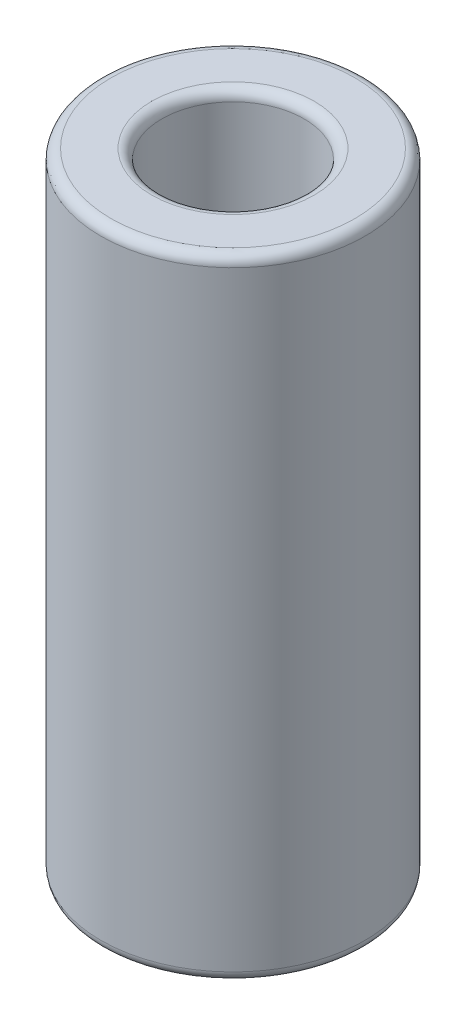
ISO-10303-21;
HEADER;
FILE_DESCRIPTION(('STEP AP214'),'2;1');
FILE_NAME('part.step','',(''),(''),'','','');
FILE_SCHEMA(('AUTOMOTIVE_DESIGN { 1 0 10303 214 1 1 1 1 }'));
ENDSEC;
DATA;
#1=APPLICATION_CONTEXT('core data for automotive mechanical design processes');
#2=APPLICATION_PROTOCOL_DEFINITION('international standard','automotive_design',2000,#1);
#3=PRODUCT_CONTEXT('',#1,'mechanical');
#4=PRODUCT('Part','Part','',(#3));
#5=PRODUCT_RELATED_PRODUCT_CATEGORY('part','',(#4));
#6=PRODUCT_DEFINITION_FORMATION('','',#4);
#7=PRODUCT_DEFINITION_CONTEXT('part definition',#1,'design');
#8=PRODUCT_DEFINITION('design','',#6,#7);
#9=PRODUCT_DEFINITION_SHAPE('','',#8);
#10=(LENGTH_UNIT() NAMED_UNIT(*) SI_UNIT(.MILLI.,.METRE.));
#11=(NAMED_UNIT(*) PLANE_ANGLE_UNIT() SI_UNIT($,.RADIAN.));
#12=(NAMED_UNIT(*) SI_UNIT($,.STERADIAN.) SOLID_ANGLE_UNIT());
#13=UNCERTAINTY_MEASURE_WITH_UNIT(LENGTH_MEASURE(1.E-05),#10,'distance_accuracy_value','');
#14=(GEOMETRIC_REPRESENTATION_CONTEXT(3) GLOBAL_UNCERTAINTY_ASSIGNED_CONTEXT((#13)) GLOBAL_UNIT_ASSIGNED_CONTEXT((#10,
#11,#12)) REPRESENTATION_CONTEXT('',''));
#15=CARTESIAN_POINT('',(0.,0.,0.));
#16=DIRECTION('',(0.,0.,1.));
#17=DIRECTION('',(1.,0.,0.));
#18=AXIS2_PLACEMENT_3D('',#15,#16,#17);
#19=CARTESIAN_POINT('',(0.,62.,0.));
#20=DIRECTION('',(0.,1.,0.));
#21=DIRECTION('',(0.,0.,1.));
#22=AXIS2_PLACEMENT_3D('',#19,#20,#21);
#23=PLANE('',#22);
#24=CARTESIAN_POINT('',(0.,62.,0.));
#25=DIRECTION('',(0.,1.,0.));
#26=DIRECTION('',(0.,0.,1.));
#27=AXIS2_PLACEMENT_3D('',#24,#25,#26);
#28=CIRCLE('',#27,8.);
#29=CARTESIAN_POINT('',(0.,62.,8.));
#30=VERTEX_POINT('',#29);
#31=EDGE_CURVE('E10',#30,#30,#28,.F.);
#32=ORIENTED_EDGE('',*,*,#31,.T.);
#33=EDGE_LOOP('',(#32));
#34=FACE_BOUND('',#33,.T.);
#35=CARTESIAN_POINT('',(0.,62.,0.));
#36=DIRECTION('',(0.,1.,0.));
#37=DIRECTION('',(0.,0.,1.));
#38=AXIS2_PLACEMENT_3D('',#35,#36,#37);
#39=CIRCLE('',#38,12.);
#40=CARTESIAN_POINT('',(0.,62.,12.));
#41=VERTEX_POINT('',#40);
#42=EDGE_CURVE('E67',#41,#41,#39,.T.);
#43=ORIENTED_EDGE('',*,*,#42,.T.);
#44=EDGE_LOOP('',(#43));
#45=FACE_BOUND('',#44,.T.);
#46=ADVANCED_FACE('F43',(#34,#45),#23,.T.);
#47=CARTESIAN_POINT('',(0.,0.,0.));
#48=DIRECTION('',(0.,1.,0.));
#49=DIRECTION('',(0.,0.,1.));
#50=AXIS2_PLACEMENT_3D('',#47,#48,#49);
#51=PLANE('',#50);
#52=CARTESIAN_POINT('',(0.,0.,0.));
#53=DIRECTION('',(0.,1.,0.));
#54=DIRECTION('',(0.,0.,1.));
#55=AXIS2_PLACEMENT_3D('',#52,#53,#54);
#56=CIRCLE('',#55,8.);
#57=CARTESIAN_POINT('',(0.,0.,8.));
#58=VERTEX_POINT('',#57);
#59=EDGE_CURVE('E61',#58,#58,#56,.T.);
#60=ORIENTED_EDGE('',*,*,#59,.T.);
#61=EDGE_LOOP('',(#60));
#62=FACE_BOUND('',#61,.T.);
#63=CARTESIAN_POINT('',(0.,0.,0.));
#64=DIRECTION('',(0.,1.,0.));
#65=DIRECTION('',(0.,0.,1.));
#66=AXIS2_PLACEMENT_3D('',#63,#64,#65);
#67=CIRCLE('',#66,12.);
#68=CARTESIAN_POINT('',(0.,0.,12.));
#69=VERTEX_POINT('',#68);
#70=EDGE_CURVE('E71',#69,#69,#67,.F.);
#71=ORIENTED_EDGE('',*,*,#70,.T.);
#72=EDGE_LOOP('',(#71));
#73=FACE_BOUND('',#72,.T.);
#74=ADVANCED_FACE('F95',(#62,#73),#51,.F.);
#75=CARTESIAN_POINT('',(0.,62.,0.));
#76=DIRECTION('',(0.,-1.,0.));
#77=DIRECTION('',(0.,0.,-1.));
#78=AXIS2_PLACEMENT_3D('',#75,#76,#77);
#79=CYLINDRICAL_SURFACE('',#78,13.);
#80=CARTESIAN_POINT('',(0.,1.,0.));
#81=DIRECTION('',(0.,1.,0.));
#82=DIRECTION('',(0.,0.,1.));
#83=AXIS2_PLACEMENT_3D('',#80,#81,#82);
#84=CIRCLE('',#83,13.);
#85=CARTESIAN_POINT('',(0.,1.,13.));
#86=VERTEX_POINT('',#85);
#87=EDGE_CURVE('E75',#86,#86,#84,.T.);
#88=ORIENTED_EDGE('',*,*,#87,.T.);
#89=EDGE_LOOP('',(#88));
#90=FACE_BOUND('',#89,.T.);
#91=CARTESIAN_POINT('',(0.,61.,0.));
#92=DIRECTION('',(0.,1.,0.));
#93=DIRECTION('',(0.,0.,1.));
#94=AXIS2_PLACEMENT_3D('',#91,#92,#93);
#95=CIRCLE('',#94,13.);
#96=CARTESIAN_POINT('',(0.,61.,13.));
#97=VERTEX_POINT('',#96);
#98=EDGE_CURVE('E79',#97,#97,#95,.F.);
#99=ORIENTED_EDGE('',*,*,#98,.T.);
#100=EDGE_LOOP('',(#99));
#101=FACE_BOUND('',#100,.T.);
#102=ADVANCED_FACE('F84',(#90,#101),#79,.T.);
#103=CARTESIAN_POINT('',(0.,62.,0.));
#104=DIRECTION('',(0.,-1.,0.));
#105=DIRECTION('',(0.,0.,-1.));
#106=AXIS2_PLACEMENT_3D('',#103,#104,#105);
#107=CYLINDRICAL_SURFACE('',#106,7.);
#108=CARTESIAN_POINT('',(0.,1.,0.));
#109=DIRECTION('',(0.,1.,0.));
#110=DIRECTION('',(0.,0.,1.));
#111=AXIS2_PLACEMENT_3D('',#108,#109,#110);
#112=CIRCLE('',#111,7.);
#113=CARTESIAN_POINT('',(0.,1.,7.));
#114=VERTEX_POINT('',#113);
#115=EDGE_CURVE('E51',#114,#114,#112,.F.);
#116=ORIENTED_EDGE('',*,*,#115,.T.);
#117=EDGE_LOOP('',(#116));
#118=FACE_BOUND('',#117,.T.);
#119=CARTESIAN_POINT('',(0.,61.,0.));
#120=DIRECTION('',(0.,1.,0.));
#121=DIRECTION('',(0.,0.,1.));
#122=AXIS2_PLACEMENT_3D('',#119,#120,#121);
#123=CIRCLE('',#122,7.);
#124=CARTESIAN_POINT('',(0.,61.,7.));
#125=VERTEX_POINT('',#124);
#126=EDGE_CURVE('E56',#125,#125,#123,.T.);
#127=ORIENTED_EDGE('',*,*,#126,.T.);
#128=EDGE_LOOP('',(#127));
#129=FACE_BOUND('',#128,.T.);
#130=ADVANCED_FACE('F103',(#118,#129),#107,.F.);
#131=CARTESIAN_POINT('',(0.,1.,0.));
#132=DIRECTION('',(0.,1.,0.));
#133=DIRECTION('',(0.,0.,1.));
#134=AXIS2_PLACEMENT_3D('',#131,#132,#133);
#135=TOROIDAL_SURFACE('',#134,12.,1.);
#136=ORIENTED_EDGE('',*,*,#70,.F.);
#137=EDGE_LOOP('',(#136));
#138=FACE_BOUND('',#137,.T.);
#139=ORIENTED_EDGE('',*,*,#87,.F.);
#140=EDGE_LOOP('',(#139));
#141=FACE_BOUND('',#140,.T.);
#142=ADVANCED_FACE('F90',(#138,#141),#135,.T.);
#143=CARTESIAN_POINT('',(0.,61.,0.));
#144=DIRECTION('',(0.,1.,0.));
#145=DIRECTION('',(0.,0.,1.));
#146=AXIS2_PLACEMENT_3D('',#143,#144,#145);
#147=TOROIDAL_SURFACE('',#146,12.,1.);
#148=ORIENTED_EDGE('',*,*,#98,.F.);
#149=EDGE_LOOP('',(#148));
#150=FACE_BOUND('',#149,.T.);
#151=ORIENTED_EDGE('',*,*,#42,.F.);
#152=EDGE_LOOP('',(#151));
#153=FACE_BOUND('',#152,.T.);
#154=ADVANCED_FACE('F86',(#150,#153),#147,.T.);
#155=CARTESIAN_POINT('',(0.,1.,0.));
#156=DIRECTION('',(0.,1.,0.));
#157=DIRECTION('',(0.,0.,1.));
#158=AXIS2_PLACEMENT_3D('',#155,#156,#157);
#159=TOROIDAL_SURFACE('',#158,8.,1.);
#160=ORIENTED_EDGE('',*,*,#115,.F.);
#161=EDGE_LOOP('',(#160));
#162=FACE_BOUND('',#161,.T.);
#163=ORIENTED_EDGE('',*,*,#59,.F.);
#164=EDGE_LOOP('',(#163));
#165=FACE_BOUND('',#164,.T.);
#166=ADVANCED_FACE('F89',(#162,#165),#159,.T.);
#167=CARTESIAN_POINT('',(0.,61.,0.));
#168=DIRECTION('',(0.,1.,0.));
#169=DIRECTION('',(0.,0.,1.));
#170=AXIS2_PLACEMENT_3D('',#167,#168,#169);
#171=TOROIDAL_SURFACE('',#170,8.,1.);
#172=ORIENTED_EDGE('',*,*,#31,.F.);
#173=EDGE_LOOP('',(#172));
#174=FACE_BOUND('',#173,.T.);
#175=ORIENTED_EDGE('',*,*,#126,.F.);
#176=EDGE_LOOP('',(#175));
#177=FACE_BOUND('',#176,.T.);
#178=ADVANCED_FACE('F45',(#174,#177),#171,.T.);
#179=CLOSED_SHELL('',(#46,#74,#102,#130,#142,#154,#166,#178));
#180=MANIFOLD_SOLID_BREP('B2',#179);
#181=ADVANCED_BREP_SHAPE_REPRESENTATION('',(#18,#180),#14);
#182=SHAPE_DEFINITION_REPRESENTATION(#9,#181);
ENDSEC;
END-ISO-10303-21;
